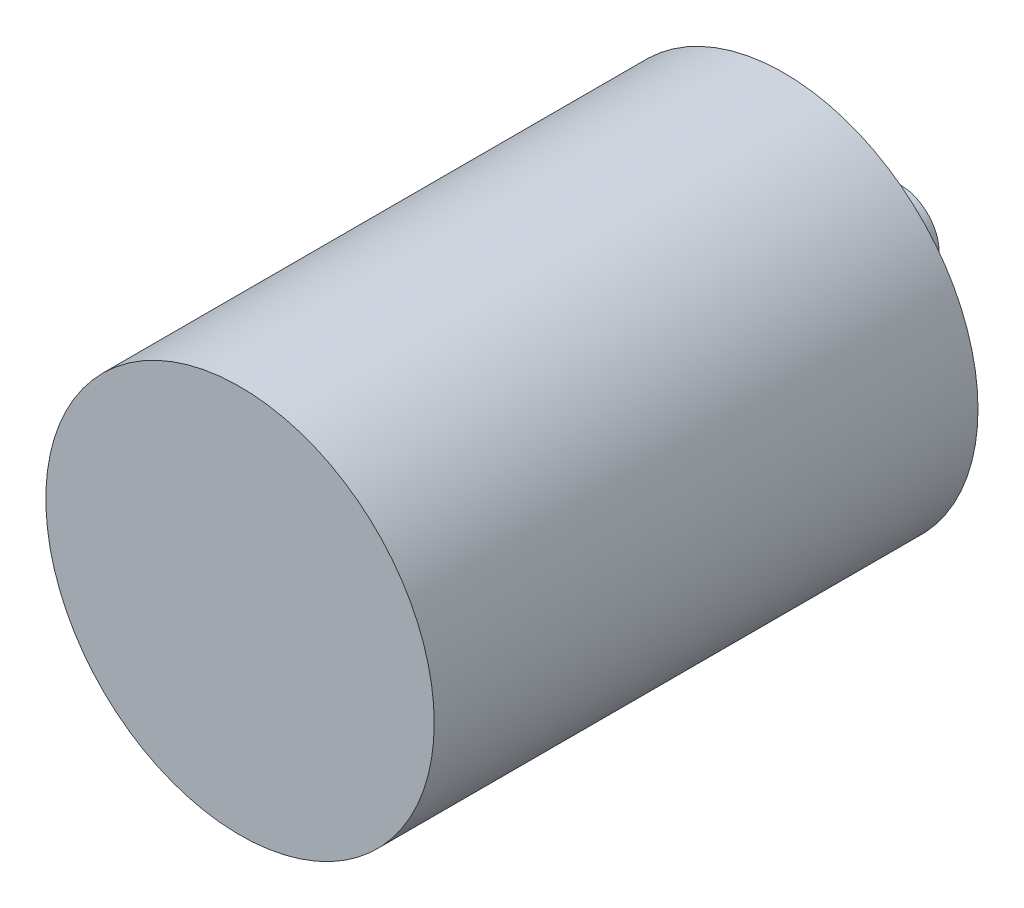
ISO-10303-21;
HEADER;
FILE_DESCRIPTION(('STEP AP214'),'2;1');
FILE_NAME('part.step','',(''),(''),'','','');
FILE_SCHEMA(('AUTOMOTIVE_DESIGN { 1 0 10303 214 1 1 1 1 }'));
ENDSEC;
DATA;
#1=APPLICATION_CONTEXT('core data for automotive mechanical design processes');
#2=APPLICATION_PROTOCOL_DEFINITION('international standard','automotive_design',2000,#1);
#3=PRODUCT_CONTEXT('',#1,'mechanical');
#4=PRODUCT('Part','Part','',(#3));
#5=PRODUCT_RELATED_PRODUCT_CATEGORY('part','',(#4));
#6=PRODUCT_DEFINITION_FORMATION('','',#4);
#7=PRODUCT_DEFINITION_CONTEXT('part definition',#1,'design');
#8=PRODUCT_DEFINITION('design','',#6,#7);
#9=PRODUCT_DEFINITION_SHAPE('','',#8);
#10=(LENGTH_UNIT() NAMED_UNIT(*) SI_UNIT(.MILLI.,.METRE.));
#11=(NAMED_UNIT(*) PLANE_ANGLE_UNIT() SI_UNIT($,.RADIAN.));
#12=(NAMED_UNIT(*) SI_UNIT($,.STERADIAN.) SOLID_ANGLE_UNIT());
#13=UNCERTAINTY_MEASURE_WITH_UNIT(LENGTH_MEASURE(1.E-05),#10,'distance_accuracy_value','');
#14=(GEOMETRIC_REPRESENTATION_CONTEXT(3) GLOBAL_UNCERTAINTY_ASSIGNED_CONTEXT((#13)) GLOBAL_UNIT_ASSIGNED_CONTEXT((#10,
#11,#12)) REPRESENTATION_CONTEXT('',''));
#15=CARTESIAN_POINT('',(0.,0.,0.));
#16=DIRECTION('',(0.,0.,1.));
#17=DIRECTION('',(1.,0.,0.));
#18=AXIS2_PLACEMENT_3D('',#15,#16,#17);
#19=CARTESIAN_POINT('',(0.,0.,28.));
#20=DIRECTION('',(0.,0.,-1.));
#21=DIRECTION('',(-1.,0.,0.));
#22=AXIS2_PLACEMENT_3D('',#19,#20,#21);
#23=CYLINDRICAL_SURFACE('',#22,10.);
#24=CARTESIAN_POINT('',(0.,0.,28.));
#25=DIRECTION('',(0.,0.,1.));
#26=DIRECTION('',(1.,0.,0.));
#27=AXIS2_PLACEMENT_3D('',#24,#25,#26);
#28=CIRCLE('',#27,10.);
#29=CARTESIAN_POINT('',(10.,0.,28.));
#30=VERTEX_POINT('',#29);
#31=EDGE_CURVE('E38',#30,#30,#28,.T.);
#32=ORIENTED_EDGE('',*,*,#31,.F.);
#33=EDGE_LOOP('',(#32));
#34=FACE_BOUND('',#33,.T.);
#35=CARTESIAN_POINT('',(0.,0.,0.));
#36=DIRECTION('',(0.,0.,1.));
#37=DIRECTION('',(1.,0.,0.));
#38=AXIS2_PLACEMENT_3D('',#35,#36,#37);
#39=CIRCLE('',#38,10.);
#40=CARTESIAN_POINT('',(10.,0.,0.));
#41=VERTEX_POINT('',#40);
#42=EDGE_CURVE('E34',#41,#41,#39,.T.);
#43=ORIENTED_EDGE('',*,*,#42,.T.);
#44=EDGE_LOOP('',(#43));
#45=FACE_BOUND('',#44,.T.);
#46=ADVANCED_FACE('F31',(#34,#45),#23,.T.);
#47=CARTESIAN_POINT('',(0.,0.,28.));
#48=DIRECTION('',(0.,0.,1.));
#49=DIRECTION('',(1.,0.,0.));
#50=AXIS2_PLACEMENT_3D('',#47,#48,#49);
#51=PLANE('',#50);
#52=ORIENTED_EDGE('',*,*,#31,.T.);
#53=EDGE_LOOP('',(#52));
#54=FACE_BOUND('',#53,.T.);
#55=ADVANCED_FACE('F55',(#54),#51,.T.);
#56=CARTESIAN_POINT('',(0.,0.,0.));
#57=DIRECTION('',(0.,0.,1.));
#58=DIRECTION('',(1.,0.,0.));
#59=AXIS2_PLACEMENT_3D('',#56,#57,#58);
#60=PLANE('',#59);
#61=CARTESIAN_POINT('',(0.,0.,0.));
#62=DIRECTION('',(0.,0.,-1.));
#63=DIRECTION('',(-1.,0.,0.));
#64=AXIS2_PLACEMENT_3D('',#61,#62,#63);
#65=CIRCLE('',#64,2.);
#66=CARTESIAN_POINT('',(-2.,0.,0.));
#67=VERTEX_POINT('',#66);
#68=EDGE_CURVE('E10',#67,#67,#65,.T.);
#69=ORIENTED_EDGE('',*,*,#68,.F.);
#70=EDGE_LOOP('',(#69));
#71=FACE_BOUND('',#70,.T.);
#72=ORIENTED_EDGE('',*,*,#42,.F.);
#73=EDGE_LOOP('',(#72));
#74=FACE_BOUND('',#73,.T.);
#75=ADVANCED_FACE('F52',(#71,#74),#60,.F.);
#76=CARTESIAN_POINT('',(0.,0.,-6.));
#77=DIRECTION('',(0.,0.,1.));
#78=DIRECTION('',(1.,0.,0.));
#79=AXIS2_PLACEMENT_3D('',#76,#77,#78);
#80=CYLINDRICAL_SURFACE('',#79,2.);
#81=CARTESIAN_POINT('',(0.,0.,-6.));
#82=DIRECTION('',(0.,0.,-1.));
#83=DIRECTION('',(-1.,0.,0.));
#84=AXIS2_PLACEMENT_3D('',#81,#82,#83);
#85=CIRCLE('',#84,2.);
#86=CARTESIAN_POINT('',(-2.,0.,-6.));
#87=VERTEX_POINT('',#86);
#88=EDGE_CURVE('E44',#87,#87,#85,.T.);
#89=ORIENTED_EDGE('',*,*,#88,.F.);
#90=EDGE_LOOP('',(#89));
#91=FACE_BOUND('',#90,.T.);
#92=ORIENTED_EDGE('',*,*,#68,.T.);
#93=EDGE_LOOP('',(#92));
#94=FACE_BOUND('',#93,.T.);
#95=ADVANCED_FACE('F54',(#91,#94),#80,.T.);
#96=CARTESIAN_POINT('',(0.,0.,-6.));
#97=DIRECTION('',(0.,0.,-1.));
#98=DIRECTION('',(-1.,0.,0.));
#99=AXIS2_PLACEMENT_3D('',#96,#97,#98);
#100=PLANE('',#99);
#101=ORIENTED_EDGE('',*,*,#88,.T.);
#102=EDGE_LOOP('',(#101));
#103=FACE_BOUND('',#102,.T.);
#104=ADVANCED_FACE('F61',(#103),#100,.T.);
#105=CLOSED_SHELL('',(#46,#55,#75,#95,#104));
#106=MANIFOLD_SOLID_BREP('B2',#105);
#107=ADVANCED_BREP_SHAPE_REPRESENTATION('',(#18,#106),#14);
#108=SHAPE_DEFINITION_REPRESENTATION(#9,#107);
ENDSEC;
END-ISO-10303-21;
